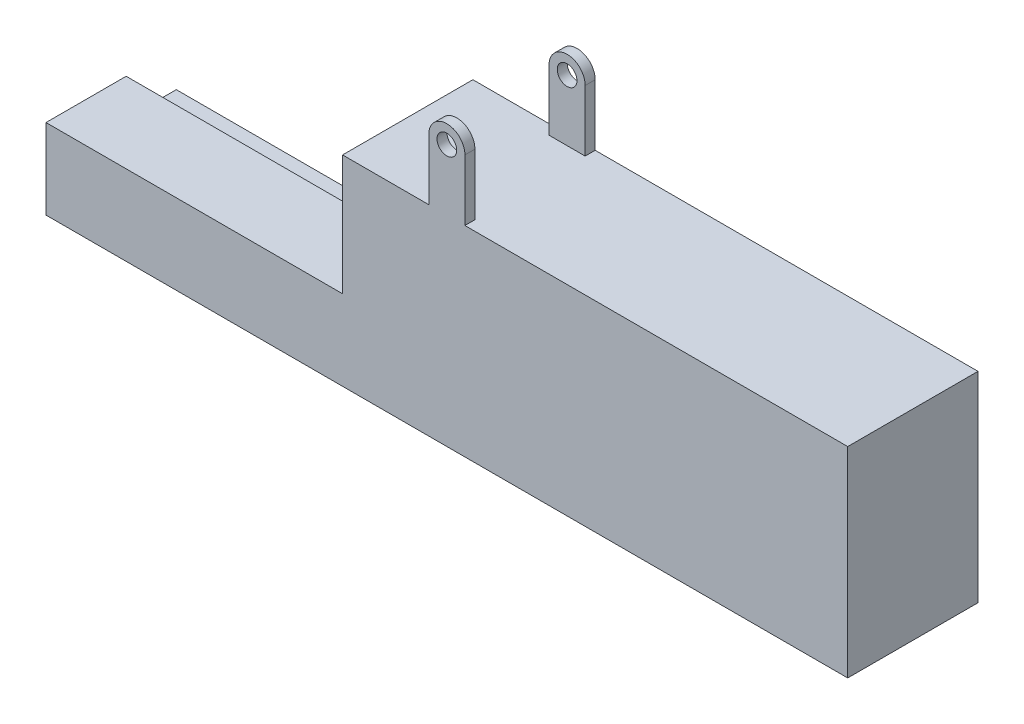
ISO-10303-21;
HEADER;
FILE_DESCRIPTION(('STEP AP214'),'2;1');
FILE_NAME('part.step','',(''),(''),'','','');
FILE_SCHEMA(('AUTOMOTIVE_DESIGN { 1 0 10303 214 1 1 1 1 }'));
ENDSEC;
DATA;
#1=APPLICATION_CONTEXT('core data for automotive mechanical design processes');
#2=APPLICATION_PROTOCOL_DEFINITION('international standard','automotive_design',2000,#1);
#3=PRODUCT_CONTEXT('',#1,'mechanical');
#4=PRODUCT('Part','Part','',(#3));
#5=PRODUCT_RELATED_PRODUCT_CATEGORY('part','',(#4));
#6=PRODUCT_DEFINITION_FORMATION('','',#4);
#7=PRODUCT_DEFINITION_CONTEXT('part definition',#1,'design');
#8=PRODUCT_DEFINITION('design','',#6,#7);
#9=PRODUCT_DEFINITION_SHAPE('','',#8);
#10=(LENGTH_UNIT() NAMED_UNIT(*) SI_UNIT(.MILLI.,.METRE.));
#11=(NAMED_UNIT(*) PLANE_ANGLE_UNIT() SI_UNIT($,.RADIAN.));
#12=(NAMED_UNIT(*) SI_UNIT($,.STERADIAN.) SOLID_ANGLE_UNIT());
#13=UNCERTAINTY_MEASURE_WITH_UNIT(LENGTH_MEASURE(1.E-05),#10,'distance_accuracy_value','');
#14=(GEOMETRIC_REPRESENTATION_CONTEXT(3) GLOBAL_UNCERTAINTY_ASSIGNED_CONTEXT((#13)) GLOBAL_UNIT_ASSIGNED_CONTEXT((#10,
#11,#12)) REPRESENTATION_CONTEXT('',''));
#15=CARTESIAN_POINT('',(0.,0.,0.));
#16=DIRECTION('',(0.,0.,1.));
#17=DIRECTION('',(1.,0.,0.));
#18=AXIS2_PLACEMENT_3D('',#15,#16,#17);
#19=CARTESIAN_POINT('',(-26.4256549218151,50.8,-16.51));
#20=DIRECTION('',(1.,0.,0.));
#21=DIRECTION('',(0.,1.,0.));
#22=AXIS2_PLACEMENT_3D('',#19,#20,#21);
#23=PLANE('',#22);
#24=DIRECTION('',(0.,0.,1.));
#25=VECTOR('',#24,1.);
#26=CARTESIAN_POINT('',(-26.4256549218151,20.32,-3.81));
#27=LINE('',#26,#25);
#28=CARTESIAN_POINT('',(-26.4256549218151,20.32,-3.81));
#29=VERTEX_POINT('',#28);
#30=CARTESIAN_POINT('',(-26.4256549218151,20.32,16.51));
#31=VERTEX_POINT('',#30);
#32=EDGE_CURVE('E282',#29,#31,#27,.T.);
#33=ORIENTED_EDGE('',*,*,#32,.T.);
#34=DIRECTION('',(0.,1.,0.));
#35=VECTOR('',#34,1.);
#36=CARTESIAN_POINT('',(-26.4256549218151,50.8,16.51));
#37=LINE('',#36,#35);
#38=CARTESIAN_POINT('',(-26.4256549218151,50.8,16.51));
#39=VERTEX_POINT('',#38);
#40=EDGE_CURVE('E292',#31,#39,#37,.T.);
#41=ORIENTED_EDGE('',*,*,#40,.T.);
#42=DIRECTION('',(0.,0.,1.));
#43=VECTOR('',#42,1.);
#44=CARTESIAN_POINT('',(-26.4256549218151,50.8,-16.51));
#45=LINE('',#44,#43);
#46=CARTESIAN_POINT('',(-26.4256549218151,50.8,-16.51));
#47=VERTEX_POINT('',#46);
#48=EDGE_CURVE('E304',#47,#39,#45,.T.);
#49=ORIENTED_EDGE('',*,*,#48,.F.);
#50=DIRECTION('',(0.,1.,0.));
#51=VECTOR('',#50,1.);
#52=CARTESIAN_POINT('',(-26.4256549218151,50.8,-16.51));
#53=LINE('',#52,#51);
#54=CARTESIAN_POINT('',(-26.4256549218151,11.0309312658915,-16.51));
#55=VERTEX_POINT('',#54);
#56=EDGE_CURVE('E297',#55,#47,#53,.T.);
#57=ORIENTED_EDGE('',*,*,#56,.F.);
#58=DIRECTION('',(0.,0.,1.));
#59=VECTOR('',#58,1.);
#60=CARTESIAN_POINT('',(-26.4256549218151,11.0309312658915,-16.51));
#61=LINE('',#60,#59);
#62=CARTESIAN_POINT('',(-26.4256549218151,11.0309312658915,-3.81));
#63=VERTEX_POINT('',#62);
#64=EDGE_CURVE('E309',#55,#63,#61,.T.);
#65=ORIENTED_EDGE('',*,*,#64,.T.);
#66=DIRECTION('',(0.,1.,0.));
#67=VECTOR('',#66,1.);
#68=CARTESIAN_POINT('',(-26.4256549218151,11.0309312658915,-3.81));
#69=LINE('',#68,#67);
#70=EDGE_CURVE('E276',#63,#29,#69,.T.);
#71=ORIENTED_EDGE('',*,*,#70,.T.);
#72=EDGE_LOOP('',(#33,#41,#49,#57,#65,#71));
#73=FACE_BOUND('',#72,.T.);
#74=ADVANCED_FACE('F60',(#73),#23,.F.);
#75=CARTESIAN_POINT('',(101.6,50.8,-16.51));
#76=DIRECTION('',(-1.,0.,0.));
#77=DIRECTION('',(0.,0.,1.));
#78=AXIS2_PLACEMENT_3D('',#75,#76,#77);
#79=PLANE('',#78);
#80=DIRECTION('',(0.,0.,-1.));
#81=VECTOR('',#80,1.);
#82=CARTESIAN_POINT('',(101.6,0.,-16.51));
#83=LINE('',#82,#81);
#84=CARTESIAN_POINT('',(101.6,0.,16.51));
#85=VERTEX_POINT('',#84);
#86=CARTESIAN_POINT('',(101.6,0.,-16.51));
#87=VERTEX_POINT('',#86);
#88=EDGE_CURVE('E308',#85,#87,#83,.T.);
#89=ORIENTED_EDGE('',*,*,#88,.T.);
#90=DIRECTION('',(0.,-1.,0.));
#91=VECTOR('',#90,1.);
#92=CARTESIAN_POINT('',(101.6,50.8,-16.51));
#93=LINE('',#92,#91);
#94=CARTESIAN_POINT('',(101.6,50.8,-16.51));
#95=VERTEX_POINT('',#94);
#96=EDGE_CURVE('E12',#95,#87,#93,.T.);
#97=ORIENTED_EDGE('',*,*,#96,.F.);
#98=DIRECTION('',(0.,0.,-1.));
#99=VECTOR('',#98,1.);
#100=CARTESIAN_POINT('',(101.6,50.8,-16.51));
#101=LINE('',#100,#99);
#102=CARTESIAN_POINT('',(101.6,50.8,16.51));
#103=VERTEX_POINT('',#102);
#104=EDGE_CURVE('E315',#103,#95,#101,.T.);
#105=ORIENTED_EDGE('',*,*,#104,.F.);
#106=DIRECTION('',(0.,-1.,0.));
#107=VECTOR('',#106,1.);
#108=CARTESIAN_POINT('',(101.6,50.8,16.51));
#109=LINE('',#108,#107);
#110=EDGE_CURVE('E329',#103,#85,#109,.T.);
#111=ORIENTED_EDGE('',*,*,#110,.T.);
#112=EDGE_LOOP('',(#89,#97,#105,#111));
#113=FACE_BOUND('',#112,.T.);
#114=ADVANCED_FACE('F62',(#113),#79,.F.);
#115=CARTESIAN_POINT('',(-101.6,50.8,-16.51));
#116=DIRECTION('',(0.,0.,1.));
#117=DIRECTION('',(1.,0.,0.));
#118=AXIS2_PLACEMENT_3D('',#115,#116,#117);
#119=PLANE('',#118);
#120=DIRECTION('',(1.,0.,0.));
#121=VECTOR('',#120,1.);
#122=CARTESIAN_POINT('',(-101.6,11.0309312658915,-16.51));
#123=LINE('',#122,#121);
#124=CARTESIAN_POINT('',(-101.6,11.0309312658915,-16.51));
#125=VERTEX_POINT('',#124);
#126=EDGE_CURVE('E293',#125,#55,#123,.T.);
#127=ORIENTED_EDGE('',*,*,#126,.T.);
#128=ORIENTED_EDGE('',*,*,#56,.T.);
#129=DIRECTION('',(-1.,0.,0.));
#130=VECTOR('',#129,1.);
#131=CARTESIAN_POINT('',(-101.6,50.8,-16.51));
#132=LINE('',#131,#130);
#133=CARTESIAN_POINT('',(-4.57200000000001,50.8,-16.51));
#134=VERTEX_POINT('',#133);
#135=EDGE_CURVE('E319',#134,#47,#132,.T.);
#136=ORIENTED_EDGE('',*,*,#135,.F.);
#137=DIRECTION('',(0.,1.,0.));
#138=VECTOR('',#137,1.);
#139=CARTESIAN_POINT('',(-4.57200000000001,50.8,-16.51));
#140=LINE('',#139,#138);
#141=CARTESIAN_POINT('',(-4.57200000000001,66.2939999999999,-16.51));
#142=VERTEX_POINT('',#141);
#143=EDGE_CURVE('E185',#134,#142,#140,.T.);
#144=ORIENTED_EDGE('',*,*,#143,.T.);
#145=CARTESIAN_POINT('',(0.,66.2939999999999,-16.51));
#146=DIRECTION('',(0.,0.,-1.));
#147=DIRECTION('',(-1.,0.,0.));
#148=AXIS2_PLACEMENT_3D('',#145,#146,#147);
#149=CIRCLE('',#148,4.572);
#150=CARTESIAN_POINT('',(4.57199999999999,66.2939999999999,-16.51));
#151=VERTEX_POINT('',#150);
#152=EDGE_CURVE('E205',#142,#151,#149,.T.);
#153=ORIENTED_EDGE('',*,*,#152,.T.);
#154=DIRECTION('',(0.,-1.,0.));
#155=VECTOR('',#154,1.);
#156=CARTESIAN_POINT('',(4.57199999999999,66.2939999999999,-16.51));
#157=LINE('',#156,#155);
#158=CARTESIAN_POINT('',(4.57199999999999,50.8,-16.51));
#159=VERTEX_POINT('',#158);
#160=EDGE_CURVE('E178',#151,#159,#157,.T.);
#161=ORIENTED_EDGE('',*,*,#160,.T.);
#162=EDGE_CURVE('E321',#95,#159,#132,.T.);
#163=ORIENTED_EDGE('',*,*,#162,.F.);
#164=ORIENTED_EDGE('',*,*,#96,.T.);
#165=DIRECTION('',(-1.,0.,0.));
#166=VECTOR('',#165,1.);
#167=CARTESIAN_POINT('',(-101.6,0.,-16.51));
#168=LINE('',#167,#166);
#169=CARTESIAN_POINT('',(-101.6,0.,-16.51));
#170=VERTEX_POINT('',#169);
#171=EDGE_CURVE('E333',#87,#170,#168,.T.);
#172=ORIENTED_EDGE('',*,*,#171,.T.);
#173=DIRECTION('',(0.,-1.,0.));
#174=VECTOR('',#173,1.);
#175=CARTESIAN_POINT('',(-101.6,50.8,-16.51));
#176=LINE('',#175,#174);
#177=EDGE_CURVE('E69',#125,#170,#176,.T.);
#178=ORIENTED_EDGE('',*,*,#177,.F.);
#179=EDGE_LOOP('',(#127,#128,#136,#144,#153,#161,#163,#164,#172,#178));
#180=FACE_BOUND('',#179,.T.);
#181=CARTESIAN_POINT('',(0.,66.294,-16.51));
#182=DIRECTION('',(0.,0.,1.));
#183=DIRECTION('',(1.,0.,0.));
#184=AXIS2_PLACEMENT_3D('',#181,#182,#183);
#185=CIRCLE('',#184,2.50000000000001);
#186=CARTESIAN_POINT('',(2.50000000000001,66.294,-16.51));
#187=VERTEX_POINT('',#186);
#188=EDGE_CURVE('E596',#187,#187,#185,.T.);
#189=ORIENTED_EDGE('',*,*,#188,.T.);
#190=EDGE_LOOP('',(#189));
#191=FACE_BOUND('',#190,.T.);
#192=ADVANCED_FACE('F357',(#180,#191),#119,.F.);
#193=CARTESIAN_POINT('',(-101.6,50.8,-16.51));
#194=DIRECTION('',(1.,0.,0.));
#195=DIRECTION('',(0.,0.,-1.));
#196=AXIS2_PLACEMENT_3D('',#193,#194,#195);
#197=PLANE('',#196);
#198=DIRECTION('',(0.,-1.,0.));
#199=VECTOR('',#198,1.);
#200=CARTESIAN_POINT('',(-101.6,50.8,16.51));
#201=LINE('',#200,#199);
#202=CARTESIAN_POINT('',(-101.6,20.32,16.51));
#203=VERTEX_POINT('',#202);
#204=CARTESIAN_POINT('',(-101.6,0.,16.51));
#205=VERTEX_POINT('',#204);
#206=EDGE_CURVE('E346',#203,#205,#201,.T.);
#207=ORIENTED_EDGE('',*,*,#206,.F.);
#208=DIRECTION('',(0.,0.,1.));
#209=VECTOR('',#208,1.);
#210=CARTESIAN_POINT('',(-101.6,20.32,-3.81));
#211=LINE('',#210,#209);
#212=CARTESIAN_POINT('',(-101.6,20.32,-3.81));
#213=VERTEX_POINT('',#212);
#214=EDGE_CURVE('E288',#213,#203,#211,.T.);
#215=ORIENTED_EDGE('',*,*,#214,.F.);
#216=DIRECTION('',(0.,1.,0.));
#217=VECTOR('',#216,1.);
#218=CARTESIAN_POINT('',(-101.6,11.0309312658915,-3.81));
#219=LINE('',#218,#217);
#220=CARTESIAN_POINT('',(-101.6,11.0309312658915,-3.81));
#221=VERTEX_POINT('',#220);
#222=EDGE_CURVE('E268',#221,#213,#219,.T.);
#223=ORIENTED_EDGE('',*,*,#222,.F.);
#224=DIRECTION('',(0.,0.,1.));
#225=VECTOR('',#224,1.);
#226=CARTESIAN_POINT('',(-101.6,11.0309312658915,-16.51));
#227=LINE('',#226,#225);
#228=EDGE_CURVE('E301',#125,#221,#227,.T.);
#229=ORIENTED_EDGE('',*,*,#228,.F.);
#230=ORIENTED_EDGE('',*,*,#177,.T.);
#231=DIRECTION('',(0.,0.,1.));
#232=VECTOR('',#231,1.);
#233=CARTESIAN_POINT('',(-101.6,0.,-16.51));
#234=LINE('',#233,#232);
#235=EDGE_CURVE('E337',#170,#205,#234,.T.);
#236=ORIENTED_EDGE('',*,*,#235,.T.);
#237=EDGE_LOOP('',(#207,#215,#223,#229,#230,#236));
#238=FACE_BOUND('',#237,.T.);
#239=ADVANCED_FACE('F352',(#238),#197,.F.);
#240=CARTESIAN_POINT('',(-101.6,50.8,16.51));
#241=DIRECTION('',(0.,0.,-1.));
#242=DIRECTION('',(-1.,0.,0.));
#243=AXIS2_PLACEMENT_3D('',#240,#241,#242);
#244=PLANE('',#243);
#245=ORIENTED_EDGE('',*,*,#40,.F.);
#246=DIRECTION('',(1.,0.,0.));
#247=VECTOR('',#246,1.);
#248=CARTESIAN_POINT('',(-101.6,20.32,16.51));
#249=LINE('',#248,#247);
#250=EDGE_CURVE('E267',#203,#31,#249,.T.);
#251=ORIENTED_EDGE('',*,*,#250,.F.);
#252=ORIENTED_EDGE('',*,*,#206,.T.);
#253=DIRECTION('',(1.,0.,0.));
#254=VECTOR('',#253,1.);
#255=CARTESIAN_POINT('',(-101.6,0.,16.51));
#256=LINE('',#255,#254);
#257=EDGE_CURVE('E320',#205,#85,#256,.T.);
#258=ORIENTED_EDGE('',*,*,#257,.T.);
#259=ORIENTED_EDGE('',*,*,#110,.F.);
#260=DIRECTION('',(1.,0.,0.));
#261=VECTOR('',#260,1.);
#262=CARTESIAN_POINT('',(-101.6,50.8,16.51));
#263=LINE('',#262,#261);
#264=CARTESIAN_POINT('',(4.572,50.7999999999999,16.51));
#265=VERTEX_POINT('',#264);
#266=EDGE_CURVE('E324',#265,#103,#263,.T.);
#267=ORIENTED_EDGE('',*,*,#266,.F.);
#268=DIRECTION('',(0.,-1.,0.));
#269=VECTOR('',#268,1.);
#270=CARTESIAN_POINT('',(4.57200000000002,0.,16.51));
#271=LINE('',#270,#269);
#272=CARTESIAN_POINT('',(4.57199999999999,66.2939999999999,16.51));
#273=VERTEX_POINT('',#272);
#274=EDGE_CURVE('E230',#273,#265,#271,.T.);
#275=ORIENTED_EDGE('',*,*,#274,.F.);
#276=CARTESIAN_POINT('',(0.,66.2939999999999,16.51));
#277=DIRECTION('',(0.,0.,1.));
#278=DIRECTION('',(1.,0.,0.));
#279=AXIS2_PLACEMENT_3D('',#276,#277,#278);
#280=CIRCLE('',#279,4.572);
#281=CARTESIAN_POINT('',(-4.57200000000001,66.2939999999999,16.51));
#282=VERTEX_POINT('',#281);
#283=EDGE_CURVE('E221',#282,#273,#280,.F.);
#284=ORIENTED_EDGE('',*,*,#283,.F.);
#285=DIRECTION('',(0.,1.,0.));
#286=VECTOR('',#285,1.);
#287=CARTESIAN_POINT('',(-4.57200000000001,0.,16.51));
#288=LINE('',#287,#286);
#289=CARTESIAN_POINT('',(-4.57200000000001,50.8,16.51));
#290=VERTEX_POINT('',#289);
#291=EDGE_CURVE('E225',#290,#282,#288,.T.);
#292=ORIENTED_EDGE('',*,*,#291,.F.);
#293=EDGE_CURVE('E325',#39,#290,#263,.T.);
#294=ORIENTED_EDGE('',*,*,#293,.F.);
#295=EDGE_LOOP('',(#245,#251,#252,#258,#259,#267,#275,#284,#292,#294));
#296=FACE_BOUND('',#295,.T.);
#297=CARTESIAN_POINT('',(0.,66.294,16.51));
#298=DIRECTION('',(0.,0.,1.));
#299=DIRECTION('',(1.,0.,0.));
#300=AXIS2_PLACEMENT_3D('',#297,#298,#299);
#301=CIRCLE('',#300,2.50000000000001);
#302=CARTESIAN_POINT('',(2.50000000000001,66.294,16.51));
#303=VERTEX_POINT('',#302);
#304=EDGE_CURVE('E233',#303,#303,#301,.T.);
#305=ORIENTED_EDGE('',*,*,#304,.F.);
#306=EDGE_LOOP('',(#305));
#307=FACE_BOUND('',#306,.T.);
#308=ADVANCED_FACE('F366',(#296,#307),#244,.F.);
#309=CARTESIAN_POINT('',(0.,50.8,0.));
#310=DIRECTION('',(0.,1.,0.));
#311=DIRECTION('',(0.,0.,1.));
#312=AXIS2_PLACEMENT_3D('',#309,#310,#311);
#313=PLANE('',#312);
#314=DIRECTION('',(0.,0.,-1.));
#315=VECTOR('',#314,1.);
#316=CARTESIAN_POINT('',(4.572,50.7999999999999,-13.97));
#317=LINE('',#316,#315);
#318=CARTESIAN_POINT('',(4.572,50.8,-13.97));
#319=VERTEX_POINT('',#318);
#320=EDGE_CURVE('E76',#319,#159,#317,.T.);
#321=ORIENTED_EDGE('',*,*,#320,.F.);
#322=DIRECTION('',(-1.,0.,0.));
#323=VECTOR('',#322,1.);
#324=CARTESIAN_POINT('',(4.572,50.7999999999999,-13.97));
#325=LINE('',#324,#323);
#326=CARTESIAN_POINT('',(-4.57200000000001,50.8,-13.97));
#327=VERTEX_POINT('',#326);
#328=EDGE_CURVE('E170',#319,#327,#325,.T.);
#329=ORIENTED_EDGE('',*,*,#328,.T.);
#330=DIRECTION('',(0.,0.,-1.));
#331=VECTOR('',#330,1.);
#332=CARTESIAN_POINT('',(-4.57200000000001,50.8,-13.97));
#333=LINE('',#332,#331);
#334=EDGE_CURVE('E82',#327,#134,#333,.T.);
#335=ORIENTED_EDGE('',*,*,#334,.T.);
#336=ORIENTED_EDGE('',*,*,#135,.T.);
#337=ORIENTED_EDGE('',*,*,#48,.T.);
#338=ORIENTED_EDGE('',*,*,#293,.T.);
#339=DIRECTION('',(0.,0.,-1.));
#340=VECTOR('',#339,1.);
#341=CARTESIAN_POINT('',(-4.57200000000001,50.8,16.51));
#342=LINE('',#341,#340);
#343=CARTESIAN_POINT('',(-4.57200000000001,50.8,13.97));
#344=VERTEX_POINT('',#343);
#345=EDGE_CURVE('E260',#290,#344,#342,.T.);
#346=ORIENTED_EDGE('',*,*,#345,.T.);
#347=DIRECTION('',(-1.,0.,0.));
#348=VECTOR('',#347,1.);
#349=CARTESIAN_POINT('',(2.69845874040836E-13,50.8,13.97));
#350=LINE('',#349,#348);
#351=CARTESIAN_POINT('',(4.572,50.7999999999999,13.97));
#352=VERTEX_POINT('',#351);
#353=EDGE_CURVE('E245',#352,#344,#350,.T.);
#354=ORIENTED_EDGE('',*,*,#353,.F.);
#355=DIRECTION('',(0.,0.,-1.));
#356=VECTOR('',#355,1.);
#357=CARTESIAN_POINT('',(4.572,50.7999999999999,16.51));
#358=LINE('',#357,#356);
#359=EDGE_CURVE('E257',#265,#352,#358,.T.);
#360=ORIENTED_EDGE('',*,*,#359,.F.);
#361=ORIENTED_EDGE('',*,*,#266,.T.);
#362=ORIENTED_EDGE('',*,*,#104,.T.);
#363=ORIENTED_EDGE('',*,*,#162,.T.);
#364=EDGE_LOOP('',(#321,#329,#335,#336,#337,#338,#346,#354,#360,#361,#362,#363));
#365=FACE_BOUND('',#364,.T.);
#366=ADVANCED_FACE('F171',(#365),#313,.T.);
#367=CARTESIAN_POINT('',(0.,0.,0.));
#368=DIRECTION('',(0.,1.,0.));
#369=DIRECTION('',(0.,0.,1.));
#370=AXIS2_PLACEMENT_3D('',#367,#368,#369);
#371=PLANE('',#370);
#372=ORIENTED_EDGE('',*,*,#88,.F.);
#373=ORIENTED_EDGE('',*,*,#257,.F.);
#374=ORIENTED_EDGE('',*,*,#235,.F.);
#375=ORIENTED_EDGE('',*,*,#171,.F.);
#376=EDGE_LOOP('',(#372,#373,#374,#375));
#377=FACE_BOUND('',#376,.T.);
#378=ADVANCED_FACE('F362',(#377),#371,.F.);
#379=CARTESIAN_POINT('',(-101.6,11.0309312658915,-16.51));
#380=DIRECTION('',(0.,-1.,0.));
#381=DIRECTION('',(0.,0.,-1.));
#382=AXIS2_PLACEMENT_3D('',#379,#380,#381);
#383=PLANE('',#382);
#384=ORIENTED_EDGE('',*,*,#228,.T.);
#385=DIRECTION('',(1.,0.,0.));
#386=VECTOR('',#385,1.);
#387=CARTESIAN_POINT('',(-101.6,11.0309312658915,-3.81));
#388=LINE('',#387,#386);
#389=EDGE_CURVE('E279',#221,#63,#388,.T.);
#390=ORIENTED_EDGE('',*,*,#389,.T.);
#391=ORIENTED_EDGE('',*,*,#64,.F.);
#392=ORIENTED_EDGE('',*,*,#126,.F.);
#393=EDGE_LOOP('',(#384,#390,#391,#392));
#394=FACE_BOUND('',#393,.T.);
#395=ADVANCED_FACE('F382',(#394),#383,.F.);
#396=CARTESIAN_POINT('',(-101.6,20.32,-3.81));
#397=DIRECTION('',(0.,-1.,0.));
#398=DIRECTION('',(0.,0.,-1.));
#399=AXIS2_PLACEMENT_3D('',#396,#397,#398);
#400=PLANE('',#399);
#401=ORIENTED_EDGE('',*,*,#250,.T.);
#402=ORIENTED_EDGE('',*,*,#32,.F.);
#403=DIRECTION('',(1.,0.,0.));
#404=VECTOR('',#403,1.);
#405=CARTESIAN_POINT('',(-101.6,20.32,-3.81));
#406=LINE('',#405,#404);
#407=EDGE_CURVE('E272',#213,#29,#406,.T.);
#408=ORIENTED_EDGE('',*,*,#407,.F.);
#409=ORIENTED_EDGE('',*,*,#214,.T.);
#410=EDGE_LOOP('',(#401,#402,#408,#409));
#411=FACE_BOUND('',#410,.T.);
#412=ADVANCED_FACE('F390',(#411),#400,.F.);
#413=CARTESIAN_POINT('',(0.,0.,-3.81));
#414=DIRECTION('',(0.,0.,-1.));
#415=DIRECTION('',(-1.,0.,0.));
#416=AXIS2_PLACEMENT_3D('',#413,#414,#415);
#417=PLANE('',#416);
#418=ORIENTED_EDGE('',*,*,#222,.T.);
#419=ORIENTED_EDGE('',*,*,#407,.T.);
#420=ORIENTED_EDGE('',*,*,#70,.F.);
#421=ORIENTED_EDGE('',*,*,#389,.F.);
#422=EDGE_LOOP('',(#418,#419,#420,#421));
#423=FACE_BOUND('',#422,.T.);
#424=ADVANCED_FACE('F386',(#423),#417,.T.);
#425=CARTESIAN_POINT('',(0.,66.2939999999999,16.51));
#426=DIRECTION('',(0.,0.,-1.));
#427=DIRECTION('',(-1.,0.,0.));
#428=AXIS2_PLACEMENT_3D('',#425,#426,#427);
#429=CYLINDRICAL_SURFACE('',#428,4.572);
#430=CARTESIAN_POINT('',(0.,66.2939999999999,13.97));
#431=DIRECTION('',(0.,0.,1.));
#432=DIRECTION('',(1.,0.,0.));
#433=AXIS2_PLACEMENT_3D('',#430,#431,#432);
#434=CIRCLE('',#433,4.572);
#435=CARTESIAN_POINT('',(-4.57200000000001,66.2939999999999,13.97));
#436=VERTEX_POINT('',#435);
#437=CARTESIAN_POINT('',(4.57199999999999,66.2939999999999,13.97));
#438=VERTEX_POINT('',#437);
#439=EDGE_CURVE('E215',#436,#438,#434,.F.);
#440=ORIENTED_EDGE('',*,*,#439,.F.);
#441=DIRECTION('',(0.,0.,-1.));
#442=VECTOR('',#441,1.);
#443=CARTESIAN_POINT('',(-4.57200000000001,66.2939999999999,16.51));
#444=LINE('',#443,#442);
#445=EDGE_CURVE('E264',#282,#436,#444,.T.);
#446=ORIENTED_EDGE('',*,*,#445,.F.);
#447=ORIENTED_EDGE('',*,*,#283,.T.);
#448=DIRECTION('',(0.,0.,-1.));
#449=VECTOR('',#448,1.);
#450=CARTESIAN_POINT('',(4.57199999999999,66.2939999999999,16.51));
#451=LINE('',#450,#449);
#452=EDGE_CURVE('E237',#273,#438,#451,.T.);
#453=ORIENTED_EDGE('',*,*,#452,.T.);
#454=EDGE_LOOP('',(#440,#446,#447,#453));
#455=FACE_BOUND('',#454,.T.);
#456=ADVANCED_FACE('F404',(#455),#429,.T.);
#457=CARTESIAN_POINT('',(-4.57200000000001,0.,16.51));
#458=DIRECTION('',(-1.,0.,0.));
#459=DIRECTION('',(0.,0.,1.));
#460=AXIS2_PLACEMENT_3D('',#457,#458,#459);
#461=PLANE('',#460);
#462=DIRECTION('',(0.,1.,0.));
#463=VECTOR('',#462,1.);
#464=CARTESIAN_POINT('',(-4.57200000000001,0.,13.97));
#465=LINE('',#464,#463);
#466=EDGE_CURVE('E241',#344,#436,#465,.T.);
#467=ORIENTED_EDGE('',*,*,#466,.F.);
#468=ORIENTED_EDGE('',*,*,#345,.F.);
#469=ORIENTED_EDGE('',*,*,#291,.T.);
#470=ORIENTED_EDGE('',*,*,#445,.T.);
#471=EDGE_LOOP('',(#467,#468,#469,#470));
#472=FACE_BOUND('',#471,.T.);
#473=ADVANCED_FACE('F395',(#472),#461,.T.);
#474=CARTESIAN_POINT('',(4.57200000000002,0.,16.51));
#475=DIRECTION('',(1.,0.,0.));
#476=DIRECTION('',(0.,1.,0.));
#477=AXIS2_PLACEMENT_3D('',#474,#475,#476);
#478=PLANE('',#477);
#479=DIRECTION('',(0.,-1.,0.));
#480=VECTOR('',#479,1.);
#481=CARTESIAN_POINT('',(4.57200000000002,0.,13.97));
#482=LINE('',#481,#480);
#483=EDGE_CURVE('E248',#438,#352,#482,.T.);
#484=ORIENTED_EDGE('',*,*,#483,.F.);
#485=ORIENTED_EDGE('',*,*,#452,.F.);
#486=ORIENTED_EDGE('',*,*,#274,.T.);
#487=ORIENTED_EDGE('',*,*,#359,.T.);
#488=EDGE_LOOP('',(#484,#485,#486,#487));
#489=FACE_BOUND('',#488,.T.);
#490=ADVANCED_FACE('F402',(#489),#478,.T.);
#491=CARTESIAN_POINT('',(0.,66.294,16.51));
#492=DIRECTION('',(0.,0.,-1.));
#493=DIRECTION('',(-1.,0.,0.));
#494=AXIS2_PLACEMENT_3D('',#491,#492,#493);
#495=CYLINDRICAL_SURFACE('',#494,2.50000000000001);
#496=ORIENTED_EDGE('',*,*,#304,.T.);
#497=EDGE_LOOP('',(#496));
#498=FACE_BOUND('',#497,.T.);
#499=CARTESIAN_POINT('',(0.,66.294,13.97));
#500=DIRECTION('',(0.,0.,1.));
#501=DIRECTION('',(1.,0.,0.));
#502=AXIS2_PLACEMENT_3D('',#499,#500,#501);
#503=CIRCLE('',#502,2.50000000000001);
#504=CARTESIAN_POINT('',(2.50000000000001,66.294,13.97));
#505=VERTEX_POINT('',#504);
#506=EDGE_CURVE('E226',#505,#505,#503,.T.);
#507=ORIENTED_EDGE('',*,*,#506,.F.);
#508=EDGE_LOOP('',(#507));
#509=FACE_BOUND('',#508,.T.);
#510=ADVANCED_FACE('F500',(#498,#509),#495,.F.);
#511=CARTESIAN_POINT('',(0.,0.,13.97));
#512=DIRECTION('',(0.,0.,1.));
#513=DIRECTION('',(1.,0.,0.));
#514=AXIS2_PLACEMENT_3D('',#511,#512,#513);
#515=PLANE('',#514);
#516=ORIENTED_EDGE('',*,*,#439,.T.);
#517=ORIENTED_EDGE('',*,*,#483,.T.);
#518=ORIENTED_EDGE('',*,*,#353,.T.);
#519=ORIENTED_EDGE('',*,*,#466,.T.);
#520=EDGE_LOOP('',(#516,#517,#518,#519));
#521=FACE_BOUND('',#520,.T.);
#522=ORIENTED_EDGE('',*,*,#506,.T.);
#523=EDGE_LOOP('',(#522));
#524=FACE_BOUND('',#523,.T.);
#525=ADVANCED_FACE('F398',(#521,#524),#515,.F.);
#526=CARTESIAN_POINT('',(0.,66.2939999999999,-13.97));
#527=DIRECTION('',(0.,0.,-1.));
#528=DIRECTION('',(-1.,0.,0.));
#529=AXIS2_PLACEMENT_3D('',#526,#527,#528);
#530=PLANE('',#529);
#531=ORIENTED_EDGE('',*,*,#328,.F.);
#532=DIRECTION('',(0.,-1.,0.));
#533=VECTOR('',#532,1.);
#534=CARTESIAN_POINT('',(4.57199999999999,66.2939999999999,-13.97));
#535=LINE('',#534,#533);
#536=CARTESIAN_POINT('',(4.57199999999999,66.2939999999999,-13.97));
#537=VERTEX_POINT('',#536);
#538=EDGE_CURVE('E188',#537,#319,#535,.T.);
#539=ORIENTED_EDGE('',*,*,#538,.F.);
#540=CARTESIAN_POINT('',(0.,66.2939999999999,-13.97));
#541=DIRECTION('',(0.,0.,-1.));
#542=DIRECTION('',(-1.,0.,0.));
#543=AXIS2_PLACEMENT_3D('',#540,#541,#542);
#544=CIRCLE('',#543,4.572);
#545=CARTESIAN_POINT('',(-4.57200000000001,66.2939999999999,-13.97));
#546=VERTEX_POINT('',#545);
#547=EDGE_CURVE('E194',#546,#537,#544,.T.);
#548=ORIENTED_EDGE('',*,*,#547,.F.);
#549=DIRECTION('',(0.,1.,0.));
#550=VECTOR('',#549,1.);
#551=CARTESIAN_POINT('',(-4.57200000000001,50.8,-13.97));
#552=LINE('',#551,#550);
#553=EDGE_CURVE('E177',#327,#546,#552,.T.);
#554=ORIENTED_EDGE('',*,*,#553,.F.);
#555=EDGE_LOOP('',(#531,#539,#548,#554));
#556=FACE_BOUND('',#555,.T.);
#557=CARTESIAN_POINT('',(0.,66.294,-13.97));
#558=DIRECTION('',(0.,0.,1.));
#559=DIRECTION('',(1.,0.,0.));
#560=AXIS2_PLACEMENT_3D('',#557,#558,#559);
#561=CIRCLE('',#560,2.50000000000001);
#562=CARTESIAN_POINT('',(2.50000000000001,66.294,-13.97));
#563=VERTEX_POINT('',#562);
#564=EDGE_CURVE('E206',#563,#563,#561,.T.);
#565=ORIENTED_EDGE('',*,*,#564,.F.);
#566=EDGE_LOOP('',(#565));
#567=FACE_BOUND('',#566,.T.);
#568=ADVANCED_FACE('F191',(#556,#567),#530,.F.);
#569=CARTESIAN_POINT('',(4.57199999999999,66.2939999999999,-13.97));
#570=DIRECTION('',(1.,0.,0.));
#571=DIRECTION('',(0.,1.,0.));
#572=AXIS2_PLACEMENT_3D('',#569,#570,#571);
#573=PLANE('',#572);
#574=ORIENTED_EDGE('',*,*,#160,.F.);
#575=DIRECTION('',(0.,0.,-1.));
#576=VECTOR('',#575,1.);
#577=CARTESIAN_POINT('',(4.57199999999999,66.2939999999999,-13.97));
#578=LINE('',#577,#576);
#579=EDGE_CURVE('E216',#537,#151,#578,.T.);
#580=ORIENTED_EDGE('',*,*,#579,.F.);
#581=ORIENTED_EDGE('',*,*,#538,.T.);
#582=ORIENTED_EDGE('',*,*,#320,.T.);
#583=EDGE_LOOP('',(#574,#580,#581,#582));
#584=FACE_BOUND('',#583,.T.);
#585=ADVANCED_FACE('F538',(#584),#573,.T.);
#586=CARTESIAN_POINT('',(0.,66.2939999999999,-13.97));
#587=DIRECTION('',(0.,0.,-1.));
#588=DIRECTION('',(-1.,0.,0.));
#589=AXIS2_PLACEMENT_3D('',#586,#587,#588);
#590=CYLINDRICAL_SURFACE('',#589,4.572);
#591=ORIENTED_EDGE('',*,*,#152,.F.);
#592=DIRECTION('',(0.,0.,-1.));
#593=VECTOR('',#592,1.);
#594=CARTESIAN_POINT('',(-4.57200000000001,66.2939999999999,-13.97));
#595=LINE('',#594,#593);
#596=EDGE_CURVE('E187',#546,#142,#595,.T.);
#597=ORIENTED_EDGE('',*,*,#596,.F.);
#598=ORIENTED_EDGE('',*,*,#547,.T.);
#599=ORIENTED_EDGE('',*,*,#579,.T.);
#600=EDGE_LOOP('',(#591,#597,#598,#599));
#601=FACE_BOUND('',#600,.T.);
#602=ADVANCED_FACE('F548',(#601),#590,.T.);
#603=CARTESIAN_POINT('',(-4.57200000000001,50.8,-13.97));
#604=DIRECTION('',(-1.,0.,0.));
#605=DIRECTION('',(0.,0.,1.));
#606=AXIS2_PLACEMENT_3D('',#603,#604,#605);
#607=PLANE('',#606);
#608=ORIENTED_EDGE('',*,*,#143,.F.);
#609=ORIENTED_EDGE('',*,*,#334,.F.);
#610=ORIENTED_EDGE('',*,*,#553,.T.);
#611=ORIENTED_EDGE('',*,*,#596,.T.);
#612=EDGE_LOOP('',(#608,#609,#610,#611));
#613=FACE_BOUND('',#612,.T.);
#614=ADVANCED_FACE('F183',(#613),#607,.T.);
#615=CARTESIAN_POINT('',(0.,66.294,-13.97));
#616=DIRECTION('',(0.,0.,-1.));
#617=DIRECTION('',(-1.,0.,0.));
#618=AXIS2_PLACEMENT_3D('',#615,#616,#617);
#619=CYLINDRICAL_SURFACE('',#618,2.50000000000001);
#620=ORIENTED_EDGE('',*,*,#564,.T.);
#621=EDGE_LOOP('',(#620));
#622=FACE_BOUND('',#621,.T.);
#623=ORIENTED_EDGE('',*,*,#188,.F.);
#624=EDGE_LOOP('',(#623));
#625=FACE_BOUND('',#624,.T.);
#626=ADVANCED_FACE('F569',(#622,#625),#619,.F.);
#627=CLOSED_SHELL('',(#74,#114,#192,#239,#308,#366,#378,#395,#412,#424,#456,#473,#490,#510,#525,
#568,#585,#602,#614,#626));
#628=MANIFOLD_SOLID_BREP('B2',#627);
#629=ADVANCED_BREP_SHAPE_REPRESENTATION('',(#18,#628),#14);
#630=SHAPE_DEFINITION_REPRESENTATION(#9,#629);
ENDSEC;
END-ISO-10303-21;
